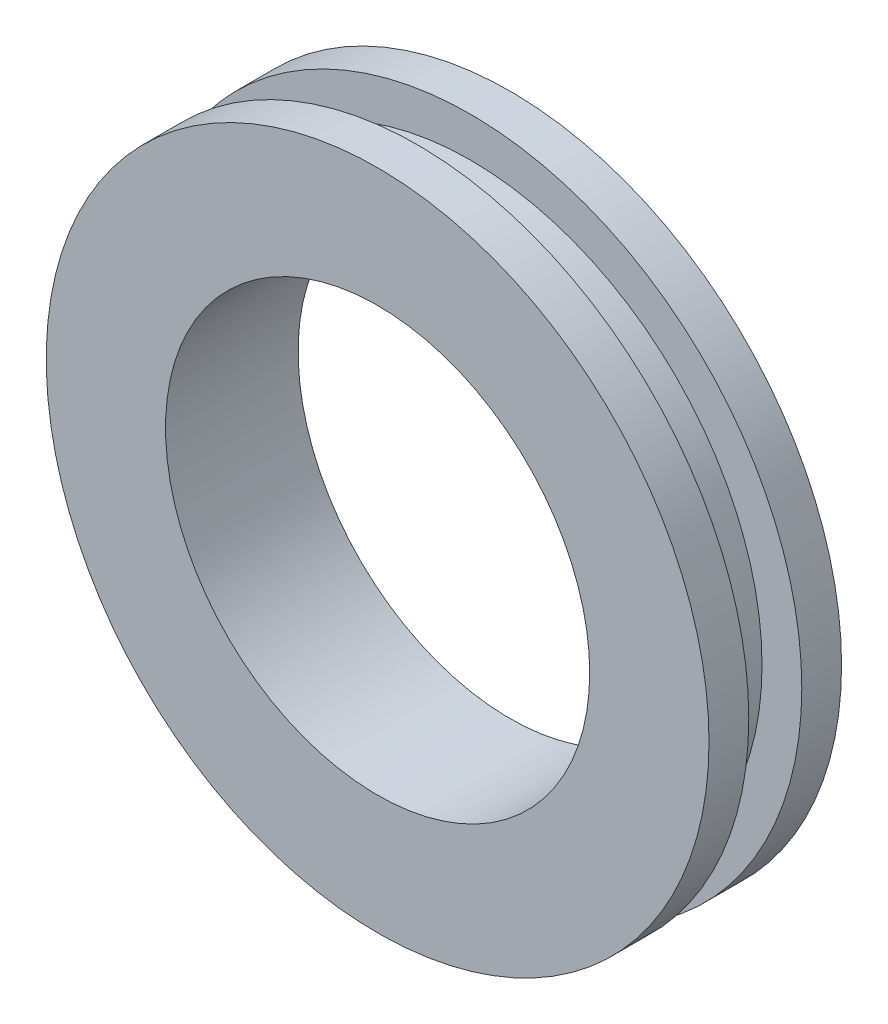
ISO-10303-21;
HEADER;
FILE_DESCRIPTION(('STEP AP214'),'2;1');
FILE_NAME('part.step','',(''),(''),'','','');
FILE_SCHEMA(('AUTOMOTIVE_DESIGN { 1 0 10303 214 1 1 1 1 }'));
ENDSEC;
DATA;
#1=APPLICATION_CONTEXT('core data for automotive mechanical design processes');
#2=APPLICATION_PROTOCOL_DEFINITION('international standard','automotive_design',2000,#1);
#3=PRODUCT_CONTEXT('',#1,'mechanical');
#4=PRODUCT('Part','Part','',(#3));
#5=PRODUCT_RELATED_PRODUCT_CATEGORY('part','',(#4));
#6=PRODUCT_DEFINITION_FORMATION('','',#4);
#7=PRODUCT_DEFINITION_CONTEXT('part definition',#1,'design');
#8=PRODUCT_DEFINITION('design','',#6,#7);
#9=PRODUCT_DEFINITION_SHAPE('','',#8);
#10=(LENGTH_UNIT() NAMED_UNIT(*) SI_UNIT(.MILLI.,.METRE.));
#11=(NAMED_UNIT(*) PLANE_ANGLE_UNIT() SI_UNIT($,.RADIAN.));
#12=(NAMED_UNIT(*) SI_UNIT($,.STERADIAN.) SOLID_ANGLE_UNIT());
#13=UNCERTAINTY_MEASURE_WITH_UNIT(LENGTH_MEASURE(1.E-05),#10,'distance_accuracy_value','');
#14=(GEOMETRIC_REPRESENTATION_CONTEXT(3) GLOBAL_UNCERTAINTY_ASSIGNED_CONTEXT((#13)) GLOBAL_UNIT_ASSIGNED_CONTEXT((#10,
#11,#12)) REPRESENTATION_CONTEXT('',''));
#15=CARTESIAN_POINT('',(0.,0.,0.));
#16=DIRECTION('',(0.,0.,1.));
#17=DIRECTION('',(1.,0.,0.));
#18=AXIS2_PLACEMENT_3D('',#15,#16,#17);
#19=CARTESIAN_POINT('',(0.,12.5,2.5));
#20=DIRECTION('',(0.,0.,-1.));
#21=DIRECTION('',(-1.,0.,0.));
#22=AXIS2_PLACEMENT_3D('',#19,#20,#21);
#23=PLANE('',#22);
#24=CARTESIAN_POINT('',(0.,0.,2.5));
#25=DIRECTION('',(0.,0.,1.));
#26=DIRECTION('',(1.,0.,0.));
#27=AXIS2_PLACEMENT_3D('',#24,#25,#26);
#28=CIRCLE('',#27,8.);
#29=CARTESIAN_POINT('',(8.,0.,2.5));
#30=VERTEX_POINT('',#29);
#31=EDGE_CURVE('E10',#30,#30,#28,.T.);
#32=ORIENTED_EDGE('',*,*,#31,.F.);
#33=EDGE_LOOP('',(#32));
#34=FACE_BOUND('',#33,.T.);
#35=CARTESIAN_POINT('',(0.,0.,2.5));
#36=DIRECTION('',(0.,0.,1.));
#37=DIRECTION('',(1.,0.,0.));
#38=AXIS2_PLACEMENT_3D('',#35,#36,#37);
#39=CIRCLE('',#38,12.5);
#40=CARTESIAN_POINT('',(12.5,0.,2.5));
#41=VERTEX_POINT('',#40);
#42=EDGE_CURVE('E59',#41,#41,#39,.T.);
#43=ORIENTED_EDGE('',*,*,#42,.T.);
#44=EDGE_LOOP('',(#43));
#45=FACE_BOUND('',#44,.T.);
#46=ADVANCED_FACE('F31',(#34,#45),#23,.F.);
#47=CARTESIAN_POINT('',(0.,0.,17.6913394855871));
#48=DIRECTION('',(0.,0.,1.));
#49=DIRECTION('',(1.,0.,0.));
#50=AXIS2_PLACEMENT_3D('',#47,#48,#49);
#51=CYLINDRICAL_SURFACE('',#50,8.);
#52=CARTESIAN_POINT('',(0.,0.,-2.5));
#53=DIRECTION('',(0.,0.,1.));
#54=DIRECTION('',(1.,0.,0.));
#55=AXIS2_PLACEMENT_3D('',#52,#53,#54);
#56=CIRCLE('',#55,8.);
#57=CARTESIAN_POINT('',(8.,0.,-2.5));
#58=VERTEX_POINT('',#57);
#59=EDGE_CURVE('E37',#58,#58,#56,.T.);
#60=ORIENTED_EDGE('',*,*,#59,.F.);
#61=EDGE_LOOP('',(#60));
#62=FACE_BOUND('',#61,.T.);
#63=ORIENTED_EDGE('',*,*,#31,.T.);
#64=EDGE_LOOP('',(#63));
#65=FACE_BOUND('',#64,.T.);
#66=ADVANCED_FACE('F96',(#62,#65),#51,.F.);
#67=CARTESIAN_POINT('',(0.,8.,-2.5));
#68=DIRECTION('',(0.,0.,1.));
#69=DIRECTION('',(1.,0.,0.));
#70=AXIS2_PLACEMENT_3D('',#67,#68,#69);
#71=PLANE('',#70);
#72=CARTESIAN_POINT('',(0.,0.,-2.5));
#73=DIRECTION('',(0.,0.,1.));
#74=DIRECTION('',(1.,0.,0.));
#75=AXIS2_PLACEMENT_3D('',#72,#73,#74);
#76=CIRCLE('',#75,12.5);
#77=CARTESIAN_POINT('',(12.5,0.,-2.5));
#78=VERTEX_POINT('',#77);
#79=EDGE_CURVE('E41',#78,#78,#76,.T.);
#80=ORIENTED_EDGE('',*,*,#79,.F.);
#81=EDGE_LOOP('',(#80));
#82=FACE_BOUND('',#81,.T.);
#83=ORIENTED_EDGE('',*,*,#59,.T.);
#84=EDGE_LOOP('',(#83));
#85=FACE_BOUND('',#84,.T.);
#86=ADVANCED_FACE('F91',(#82,#85),#71,.F.);
#87=CARTESIAN_POINT('',(0.,0.,17.6913394855871));
#88=DIRECTION('',(0.,0.,1.));
#89=DIRECTION('',(1.,0.,0.));
#90=AXIS2_PLACEMENT_3D('',#87,#88,#89);
#91=CYLINDRICAL_SURFACE('',#90,12.5);
#92=CARTESIAN_POINT('',(0.,0.,-1.));
#93=DIRECTION('',(0.,0.,1.));
#94=DIRECTION('',(1.,0.,0.));
#95=AXIS2_PLACEMENT_3D('',#92,#93,#94);
#96=CIRCLE('',#95,12.5);
#97=CARTESIAN_POINT('',(12.5,0.,-1.));
#98=VERTEX_POINT('',#97);
#99=EDGE_CURVE('E45',#98,#98,#96,.T.);
#100=ORIENTED_EDGE('',*,*,#99,.F.);
#101=EDGE_LOOP('',(#100));
#102=FACE_BOUND('',#101,.T.);
#103=ORIENTED_EDGE('',*,*,#79,.T.);
#104=EDGE_LOOP('',(#103));
#105=FACE_BOUND('',#104,.T.);
#106=ADVANCED_FACE('F85',(#102,#105),#91,.T.);
#107=CARTESIAN_POINT('',(0.,12.5,-1.));
#108=DIRECTION('',(0.,0.,-1.));
#109=DIRECTION('',(-1.,0.,0.));
#110=AXIS2_PLACEMENT_3D('',#107,#108,#109);
#111=PLANE('',#110);
#112=CARTESIAN_POINT('',(0.,0.,-1.));
#113=DIRECTION('',(0.,0.,1.));
#114=DIRECTION('',(1.,0.,0.));
#115=AXIS2_PLACEMENT_3D('',#112,#113,#114);
#116=CIRCLE('',#115,11.);
#117=CARTESIAN_POINT('',(11.,0.,-1.));
#118=VERTEX_POINT('',#117);
#119=EDGE_CURVE('E50',#118,#118,#116,.T.);
#120=ORIENTED_EDGE('',*,*,#119,.F.);
#121=EDGE_LOOP('',(#120));
#122=FACE_BOUND('',#121,.T.);
#123=ORIENTED_EDGE('',*,*,#99,.T.);
#124=EDGE_LOOP('',(#123));
#125=FACE_BOUND('',#124,.T.);
#126=ADVANCED_FACE('F79',(#122,#125),#111,.F.);
#127=CARTESIAN_POINT('',(0.,0.,17.6913394855871));
#128=DIRECTION('',(0.,0.,1.));
#129=DIRECTION('',(1.,0.,0.));
#130=AXIS2_PLACEMENT_3D('',#127,#128,#129);
#131=CYLINDRICAL_SURFACE('',#130,11.);
#132=CARTESIAN_POINT('',(0.,0.,1.));
#133=DIRECTION('',(0.,0.,1.));
#134=DIRECTION('',(1.,0.,0.));
#135=AXIS2_PLACEMENT_3D('',#132,#133,#134);
#136=CIRCLE('',#135,11.);
#137=CARTESIAN_POINT('',(11.,0.,1.));
#138=VERTEX_POINT('',#137);
#139=EDGE_CURVE('E53',#138,#138,#136,.T.);
#140=ORIENTED_EDGE('',*,*,#139,.F.);
#141=EDGE_LOOP('',(#140));
#142=FACE_BOUND('',#141,.T.);
#143=ORIENTED_EDGE('',*,*,#119,.T.);
#144=EDGE_LOOP('',(#143));
#145=FACE_BOUND('',#144,.T.);
#146=ADVANCED_FACE('F73',(#142,#145),#131,.T.);
#147=CARTESIAN_POINT('',(0.,11.,1.));
#148=DIRECTION('',(0.,0.,1.));
#149=DIRECTION('',(1.,0.,0.));
#150=AXIS2_PLACEMENT_3D('',#147,#148,#149);
#151=PLANE('',#150);
#152=CARTESIAN_POINT('',(0.,0.,1.));
#153=DIRECTION('',(0.,0.,1.));
#154=DIRECTION('',(1.,0.,0.));
#155=AXIS2_PLACEMENT_3D('',#152,#153,#154);
#156=CIRCLE('',#155,12.5);
#157=CARTESIAN_POINT('',(12.5,0.,1.));
#158=VERTEX_POINT('',#157);
#159=EDGE_CURVE('E56',#158,#158,#156,.T.);
#160=ORIENTED_EDGE('',*,*,#159,.F.);
#161=EDGE_LOOP('',(#160));
#162=FACE_BOUND('',#161,.T.);
#163=ORIENTED_EDGE('',*,*,#139,.T.);
#164=EDGE_LOOP('',(#163));
#165=FACE_BOUND('',#164,.T.);
#166=ADVANCED_FACE('F67',(#162,#165),#151,.F.);
#167=CARTESIAN_POINT('',(0.,0.,17.6913394855871));
#168=DIRECTION('',(0.,0.,1.));
#169=DIRECTION('',(1.,0.,0.));
#170=AXIS2_PLACEMENT_3D('',#167,#168,#169);
#171=CYLINDRICAL_SURFACE('',#170,12.5);
#172=ORIENTED_EDGE('',*,*,#42,.F.);
#173=EDGE_LOOP('',(#172));
#174=FACE_BOUND('',#173,.T.);
#175=ORIENTED_EDGE('',*,*,#159,.T.);
#176=EDGE_LOOP('',(#175));
#177=FACE_BOUND('',#176,.T.);
#178=ADVANCED_FACE('F64',(#174,#177),#171,.T.);
#179=CLOSED_SHELL('',(#46,#66,#86,#106,#126,#146,#166,#178));
#180=MANIFOLD_SOLID_BREP('B2',#179);
#181=ADVANCED_BREP_SHAPE_REPRESENTATION('',(#18,#180),#14);
#182=SHAPE_DEFINITION_REPRESENTATION(#9,#181);
ENDSEC;
END-ISO-10303-21;
